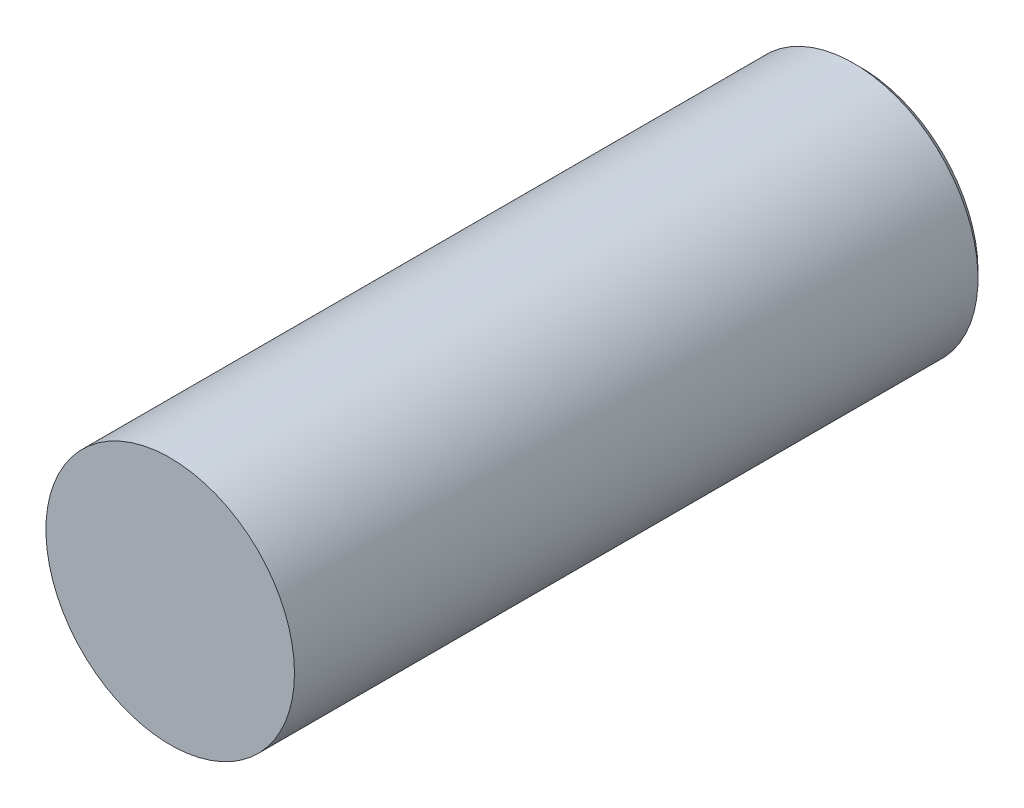
ISO-10303-21;
HEADER;
FILE_DESCRIPTION(('STEP AP214'),'2;1');
FILE_NAME('part.step','',(''),(''),'','','');
FILE_SCHEMA(('AUTOMOTIVE_DESIGN { 1 0 10303 214 1 1 1 1 }'));
ENDSEC;
DATA;
#1=APPLICATION_CONTEXT('core data for automotive mechanical design processes');
#2=APPLICATION_PROTOCOL_DEFINITION('international standard','automotive_design',2000,#1);
#3=PRODUCT_CONTEXT('',#1,'mechanical');
#4=PRODUCT('Part','Part','',(#3));
#5=PRODUCT_RELATED_PRODUCT_CATEGORY('part','',(#4));
#6=PRODUCT_DEFINITION_FORMATION('','',#4);
#7=PRODUCT_DEFINITION_CONTEXT('part definition',#1,'design');
#8=PRODUCT_DEFINITION('design','',#6,#7);
#9=PRODUCT_DEFINITION_SHAPE('','',#8);
#10=(LENGTH_UNIT() NAMED_UNIT(*) SI_UNIT(.MILLI.,.METRE.));
#11=(NAMED_UNIT(*) PLANE_ANGLE_UNIT() SI_UNIT($,.RADIAN.));
#12=(NAMED_UNIT(*) SI_UNIT($,.STERADIAN.) SOLID_ANGLE_UNIT());
#13=UNCERTAINTY_MEASURE_WITH_UNIT(LENGTH_MEASURE(1.E-05),#10,'distance_accuracy_value','');
#14=(GEOMETRIC_REPRESENTATION_CONTEXT(3) GLOBAL_UNCERTAINTY_ASSIGNED_CONTEXT((#13)) GLOBAL_UNIT_ASSIGNED_CONTEXT((#10,
#11,#12)) REPRESENTATION_CONTEXT('',''));
#15=CARTESIAN_POINT('',(0.,0.,0.));
#16=DIRECTION('',(0.,0.,1.));
#17=DIRECTION('',(1.,0.,0.));
#18=AXIS2_PLACEMENT_3D('',#15,#16,#17);
#19=CARTESIAN_POINT('',(2.97535485716379,0.,28.));
#20=DIRECTION('',(1.,0.,0.));
#21=DIRECTION('',(0.,1.,0.));
#22=AXIS2_PLACEMENT_3D('',#19,#20,#21);
#23=PLANE('',#22);
#24=DIRECTION('',(0.,-1.,0.));
#25=VECTOR('',#24,1.);
#26=CARTESIAN_POINT('',(2.97535485716379,0.,0.));
#27=LINE('',#26,#25);
#28=CARTESIAN_POINT('',(2.9753548571638,-4.97652769475316,0.));
#29=VERTEX_POINT('',#28);
#30=CARTESIAN_POINT('',(2.9753548571638,-7.96223985282734,0.));
#31=VERTEX_POINT('',#30);
#32=EDGE_CURVE('E132',#29,#31,#27,.T.);
#33=ORIENTED_EDGE('',*,*,#32,.T.);
#34=CARTESIAN_POINT('',(2.9753548571638,-7.96223985282734,0.));
#35=CARTESIAN_POINT('',(2.9753548571638,-8.05101448501539,0.0831679530623609));
#36=CARTESIAN_POINT('',(2.9753548571638,-8.13971135823002,0.166418597298855));
#37=CARTESIAN_POINT('',(2.9753548571638,-8.31694958230306,0.33308526397375));
#38=CARTESIAN_POINT('',(2.9753548571638,-8.40549093316922,0.416501286403921));
#39=CARTESIAN_POINT('',(2.9753548571638,-8.49395452506969,0.499999999999997));
#40=B_SPLINE_CURVE_WITH_KNOTS('',3,(#34,#35,#36,#37,#38,#39),.UNSPECIFIED.,.F.,.F.,(4,2,4),(0.,
0.364938687664912,0.729877357171817),.UNSPECIFIED.);
#41=CARTESIAN_POINT('',(2.9753548571638,-8.49395452506969,0.499999999999997));
#42=VERTEX_POINT('',#41);
#43=EDGE_CURVE('E11',#31,#42,#40,.T.);
#44=ORIENTED_EDGE('',*,*,#43,.T.);
#45=DIRECTION('',(0.,0.,-1.));
#46=VECTOR('',#45,1.);
#47=CARTESIAN_POINT('',(2.9753548571638,-8.49395452506969,28.));
#48=LINE('',#47,#46);
#49=CARTESIAN_POINT('',(2.9753548571638,-8.49395452506969,28.));
#50=VERTEX_POINT('',#49);
#51=EDGE_CURVE('E106',#50,#42,#48,.T.);
#52=ORIENTED_EDGE('',*,*,#51,.F.);
#53=DIRECTION('',(0.,-1.,0.));
#54=VECTOR('',#53,1.);
#55=CARTESIAN_POINT('',(2.97535485716379,0.,28.));
#56=LINE('',#55,#54);
#57=CARTESIAN_POINT('',(2.9753548571638,-4.97652769475316,28.));
#58=VERTEX_POINT('',#57);
#59=EDGE_CURVE('E102',#58,#50,#56,.T.);
#60=ORIENTED_EDGE('',*,*,#59,.F.);
#61=DIRECTION('',(0.,0.,-1.));
#62=VECTOR('',#61,1.);
#63=CARTESIAN_POINT('',(2.9753548571638,-4.97652769475316,28.));
#64=LINE('',#63,#62);
#65=EDGE_CURVE('E104',#58,#29,#64,.T.);
#66=ORIENTED_EDGE('',*,*,#65,.T.);
#67=EDGE_LOOP('',(#33,#44,#52,#60,#66));
#68=FACE_BOUND('',#67,.T.);
#69=ADVANCED_FACE('F49',(#68),#23,.F.);
#70=CARTESIAN_POINT('',(0.,0.,28.));
#71=DIRECTION('',(0.,0.,-1.));
#72=DIRECTION('',(-1.,0.,0.));
#73=AXIS2_PLACEMENT_3D('',#70,#71,#72);
#74=CYLINDRICAL_SURFACE('',#73,9.);
#75=ORIENTED_EDGE('',*,*,#51,.T.);
#76=CARTESIAN_POINT('',(0.,0.,0.499999999999997));
#77=DIRECTION('',(0.,0.,1.));
#78=DIRECTION('',(1.,0.,0.));
#79=AXIS2_PLACEMENT_3D('',#76,#77,#78);
#80=CIRCLE('',#79,9.);
#81=CARTESIAN_POINT('',(-3.02464514283621,-8.47652769475316,0.499999999999997));
#82=VERTEX_POINT('',#81);
#83=EDGE_CURVE('E148',#42,#82,#80,.T.);
#84=ORIENTED_EDGE('',*,*,#83,.T.);
#85=DIRECTION('',(0.,0.,-1.));
#86=VECTOR('',#85,1.);
#87=CARTESIAN_POINT('',(-3.02464514283621,-8.47652769475316,28.));
#88=LINE('',#87,#86);
#89=CARTESIAN_POINT('',(-3.02464514283621,-8.47652769475316,28.));
#90=VERTEX_POINT('',#89);
#91=EDGE_CURVE('E143',#90,#82,#88,.T.);
#92=ORIENTED_EDGE('',*,*,#91,.F.);
#93=CARTESIAN_POINT('',(0.,0.,28.));
#94=DIRECTION('',(0.,0.,1.));
#95=DIRECTION('',(1.,0.,0.));
#96=AXIS2_PLACEMENT_3D('',#93,#94,#95);
#97=CIRCLE('',#96,9.);
#98=EDGE_CURVE('E266',#90,#50,#97,.T.);
#99=ORIENTED_EDGE('',*,*,#98,.T.);
#100=EDGE_LOOP('',(#75,#84,#92,#99));
#101=FACE_BOUND('',#100,.T.);
#102=CARTESIAN_POINT('',(0.,0.,50.));
#103=DIRECTION('',(0.,0.,1.));
#104=DIRECTION('',(1.,0.,0.));
#105=AXIS2_PLACEMENT_3D('',#102,#103,#104);
#106=CIRCLE('',#105,9.);
#107=CARTESIAN_POINT('',(9.,0.,50.));
#108=VERTEX_POINT('',#107);
#109=EDGE_CURVE('E136',#108,#108,#106,.T.);
#110=ORIENTED_EDGE('',*,*,#109,.F.);
#111=EDGE_LOOP('',(#110));
#112=FACE_BOUND('',#111,.T.);
#113=ADVANCED_FACE('F163',(#101,#112),#74,.T.);
#114=CARTESIAN_POINT('',(-3.02464514283621,0.,28.));
#115=DIRECTION('',(-1.,0.,0.));
#116=DIRECTION('',(0.,0.,1.));
#117=AXIS2_PLACEMENT_3D('',#114,#115,#116);
#118=PLANE('',#117);
#119=ORIENTED_EDGE('',*,*,#91,.T.);
#120=CARTESIAN_POINT('',(-3.02464514283621,-8.47652769475316,0.499999999999997));
#121=CARTESIAN_POINT('',(-3.02464514283621,-8.38787558383391,0.416494657312729));
#122=CARTESIAN_POINT('',(-3.02464514283621,-8.29914277405277,0.33307532041658));
#123=CARTESIAN_POINT('',(-3.02464514283621,-8.12151575200721,0.166408653740696));
#124=CARTESIAN_POINT('',(-3.02464514283621,-8.03262153973413,0.0831613239701794));
#125=CARTESIAN_POINT('',(-3.02464514283621,-7.94364662859051,0.));
#126=B_SPLINE_CURVE_WITH_KNOTS('',3,(#120,#121,#122,#123,#124,#125),.UNSPECIFIED.,.F.,.F.,(4,2,
4),(0.,0.365363758053042,0.730727535685892),.UNSPECIFIED.);
#127=CARTESIAN_POINT('',(-3.02464514283621,-7.94364662859051,0.));
#128=VERTEX_POINT('',#127);
#129=EDGE_CURVE('E78',#82,#128,#126,.T.);
#130=ORIENTED_EDGE('',*,*,#129,.T.);
#131=DIRECTION('',(0.,1.,0.));
#132=VECTOR('',#131,1.);
#133=CARTESIAN_POINT('',(-3.02464514283621,0.,0.));
#134=LINE('',#133,#132);
#135=CARTESIAN_POINT('',(-3.02464514283621,-4.97652769475316,0.));
#136=VERTEX_POINT('',#135);
#137=EDGE_CURVE('E135',#128,#136,#134,.T.);
#138=ORIENTED_EDGE('',*,*,#137,.T.);
#139=DIRECTION('',(0.,0.,-1.));
#140=VECTOR('',#139,1.);
#141=CARTESIAN_POINT('',(-3.02464514283621,-4.97652769475316,28.));
#142=LINE('',#141,#140);
#143=CARTESIAN_POINT('',(-3.02464514283621,-4.97652769475316,28.));
#144=VERTEX_POINT('',#143);
#145=EDGE_CURVE('E123',#144,#136,#142,.T.);
#146=ORIENTED_EDGE('',*,*,#145,.F.);
#147=DIRECTION('',(0.,1.,0.));
#148=VECTOR('',#147,1.);
#149=CARTESIAN_POINT('',(-3.02464514283621,0.,28.));
#150=LINE('',#149,#148);
#151=EDGE_CURVE('E112',#90,#144,#150,.T.);
#152=ORIENTED_EDGE('',*,*,#151,.F.);
#153=EDGE_LOOP('',(#119,#130,#138,#146,#152));
#154=FACE_BOUND('',#153,.T.);
#155=ADVANCED_FACE('F158',(#154),#118,.F.);
#156=CARTESIAN_POINT('',(0.,-4.97652769475316,28.));
#157=DIRECTION('',(0.,1.,0.));
#158=DIRECTION('',(-1.,0.,0.));
#159=AXIS2_PLACEMENT_3D('',#156,#157,#158);
#160=PLANE('',#159);
#161=DIRECTION('',(1.,0.,0.));
#162=VECTOR('',#161,1.);
#163=CARTESIAN_POINT('',(0.,-4.97652769475316,0.));
#164=LINE('',#163,#162);
#165=EDGE_CURVE('E113',#136,#29,#164,.T.);
#166=ORIENTED_EDGE('',*,*,#165,.T.);
#167=ORIENTED_EDGE('',*,*,#65,.F.);
#168=DIRECTION('',(1.,0.,0.));
#169=VECTOR('',#168,1.);
#170=CARTESIAN_POINT('',(0.,-4.97652769475316,28.));
#171=LINE('',#170,#169);
#172=EDGE_CURVE('E119',#144,#58,#171,.T.);
#173=ORIENTED_EDGE('',*,*,#172,.F.);
#174=ORIENTED_EDGE('',*,*,#145,.T.);
#175=EDGE_LOOP('',(#166,#167,#173,#174));
#176=FACE_BOUND('',#175,.T.);
#177=ADVANCED_FACE('F117',(#176),#160,.F.);
#178=CARTESIAN_POINT('',(0.,0.,0.));
#179=DIRECTION('',(0.,0.,1.));
#180=DIRECTION('',(1.,0.,0.));
#181=AXIS2_PLACEMENT_3D('',#178,#179,#180);
#182=PLANE('',#181);
#183=ORIENTED_EDGE('',*,*,#137,.F.);
#184=CARTESIAN_POINT('',(0.,0.,0.));
#185=DIRECTION('',(0.,0.,1.));
#186=DIRECTION('',(1.,0.,0.));
#187=AXIS2_PLACEMENT_3D('',#184,#185,#186);
#188=CIRCLE('',#187,8.50000000000001);
#189=EDGE_CURVE('E64',#128,#31,#188,.F.);
#190=ORIENTED_EDGE('',*,*,#189,.T.);
#191=ORIENTED_EDGE('',*,*,#32,.F.);
#192=ORIENTED_EDGE('',*,*,#165,.F.);
#193=EDGE_LOOP('',(#183,#190,#191,#192));
#194=FACE_BOUND('',#193,.T.);
#195=ADVANCED_FACE('F185',(#194),#182,.F.);
#196=CARTESIAN_POINT('',(0.,0.,28.));
#197=DIRECTION('',(0.,0.,1.));
#198=DIRECTION('',(1.,0.,0.));
#199=AXIS2_PLACEMENT_3D('',#196,#197,#198);
#200=PLANE('',#199);
#201=ORIENTED_EDGE('',*,*,#172,.T.);
#202=ORIENTED_EDGE('',*,*,#59,.T.);
#203=ORIENTED_EDGE('',*,*,#98,.F.);
#204=ORIENTED_EDGE('',*,*,#151,.T.);
#205=EDGE_LOOP('',(#201,#202,#203,#204));
#206=FACE_BOUND('',#205,.T.);
#207=ADVANCED_FACE('F125',(#206),#200,.F.);
#208=CARTESIAN_POINT('',(0.,0.,50.));
#209=DIRECTION('',(0.,0.,1.));
#210=DIRECTION('',(1.,0.,0.));
#211=AXIS2_PLACEMENT_3D('',#208,#209,#210);
#212=PLANE('',#211);
#213=ORIENTED_EDGE('',*,*,#109,.T.);
#214=EDGE_LOOP('',(#213));
#215=FACE_BOUND('',#214,.T.);
#216=ADVANCED_FACE('F196',(#215),#212,.T.);
#217=CARTESIAN_POINT('',(0.,0.,0.499999999999997));
#218=DIRECTION('',(0.,0.,1.));
#219=DIRECTION('',(1.,0.,0.));
#220=AXIS2_PLACEMENT_3D('',#217,#218,#219);
#221=CONICAL_SURFACE('',#220,9.,0.785398163397447);
#222=ORIENTED_EDGE('',*,*,#43,.F.);
#223=ORIENTED_EDGE('',*,*,#189,.F.);
#224=ORIENTED_EDGE('',*,*,#129,.F.);
#225=ORIENTED_EDGE('',*,*,#83,.F.);
#226=EDGE_LOOP('',(#222,#223,#224,#225));
#227=FACE_BOUND('',#226,.T.);
#228=ADVANCED_FACE('F52',(#227),#221,.T.);
#229=CLOSED_SHELL('',(#69,#113,#155,#177,#195,#207,#216,#228));
#230=MANIFOLD_SOLID_BREP('B2',#229);
#231=ADVANCED_BREP_SHAPE_REPRESENTATION('',(#18,#230),#14);
#232=SHAPE_DEFINITION_REPRESENTATION(#9,#231);
ENDSEC;
END-ISO-10303-21;
